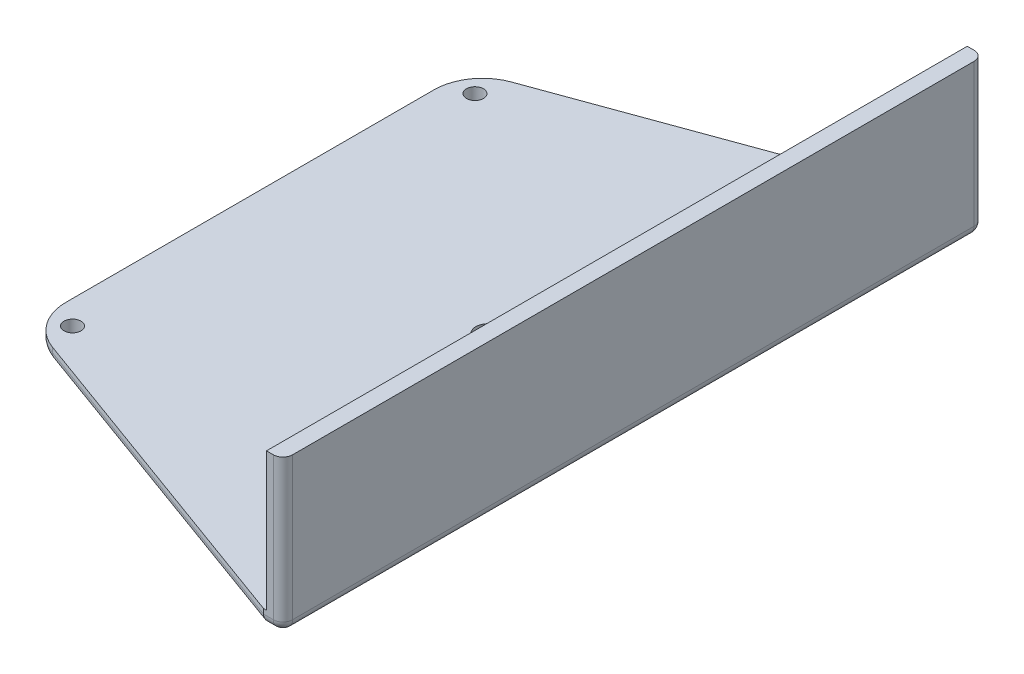
ISO-10303-21;
HEADER;
FILE_DESCRIPTION(('STEP AP214'),'2;1');
FILE_NAME('part.step','',(''),(''),'','','');
FILE_SCHEMA(('AUTOMOTIVE_DESIGN { 1 0 10303 214 1 1 1 1 }'));
ENDSEC;
DATA;
#1=APPLICATION_CONTEXT('core data for automotive mechanical design processes');
#2=APPLICATION_PROTOCOL_DEFINITION('international standard','automotive_design',2000,#1);
#3=PRODUCT_CONTEXT('',#1,'mechanical');
#4=PRODUCT('Part','Part','',(#3));
#5=PRODUCT_RELATED_PRODUCT_CATEGORY('part','',(#4));
#6=PRODUCT_DEFINITION_FORMATION('','',#4);
#7=PRODUCT_DEFINITION_CONTEXT('part definition',#1,'design');
#8=PRODUCT_DEFINITION('design','',#6,#7);
#9=PRODUCT_DEFINITION_SHAPE('','',#8);
#10=(LENGTH_UNIT() NAMED_UNIT(*) SI_UNIT(.MILLI.,.METRE.));
#11=(NAMED_UNIT(*) PLANE_ANGLE_UNIT() SI_UNIT($,.RADIAN.));
#12=(NAMED_UNIT(*) SI_UNIT($,.STERADIAN.) SOLID_ANGLE_UNIT());
#13=UNCERTAINTY_MEASURE_WITH_UNIT(LENGTH_MEASURE(1.E-05),#10,'distance_accuracy_value','');
#14=(GEOMETRIC_REPRESENTATION_CONTEXT(3) GLOBAL_UNCERTAINTY_ASSIGNED_CONTEXT((#13)) GLOBAL_UNIT_ASSIGNED_CONTEXT((#10,
#11,#12)) REPRESENTATION_CONTEXT('',''));
#15=CARTESIAN_POINT('',(0.,0.,0.));
#16=DIRECTION('',(0.,0.,1.));
#17=DIRECTION('',(1.,0.,0.));
#18=AXIS2_PLACEMENT_3D('',#15,#16,#17);
#19=CARTESIAN_POINT('',(0.,0.,0.));
#20=DIRECTION('',(0.,1.,0.));
#21=DIRECTION('',(0.,0.,1.));
#22=AXIS2_PLACEMENT_3D('',#19,#20,#21);
#23=PLANE('',#22);
#24=CARTESIAN_POINT('',(-30.,0.,0.));
#25=DIRECTION('',(0.,-1.,0.));
#26=DIRECTION('',(0.,0.,-1.));
#27=AXIS2_PLACEMENT_3D('',#24,#25,#26);
#28=CIRCLE('',#27,2.5);
#29=CARTESIAN_POINT('',(-30.,0.,-2.50000000000001));
#30=VERTEX_POINT('',#29);
#31=EDGE_CURVE('E360',#30,#30,#28,.T.);
#32=ORIENTED_EDGE('',*,*,#31,.F.);
#33=EDGE_LOOP('',(#32));
#34=FACE_BOUND('',#33,.T.);
#35=DIRECTION('',(1.,0.,0.));
#36=VECTOR('',#35,1.);
#37=CARTESIAN_POINT('',(-10.25,0.,-7.5));
#38=LINE('',#37,#36);
#39=CARTESIAN_POINT('',(-19.75,0.,-7.5));
#40=VERTEX_POINT('',#39);
#41=CARTESIAN_POINT('',(-10.25,0.,-7.5));
#42=VERTEX_POINT('',#41);
#43=EDGE_CURVE('E185',#40,#42,#38,.T.);
#44=ORIENTED_EDGE('',*,*,#43,.F.);
#45=DIRECTION('',(0.,0.,-1.));
#46=VECTOR('',#45,1.);
#47=CARTESIAN_POINT('',(-19.75,0.,7.5));
#48=LINE('',#47,#46);
#49=CARTESIAN_POINT('',(-19.75,0.,7.5));
#50=VERTEX_POINT('',#49);
#51=EDGE_CURVE('E52',#50,#40,#48,.T.);
#52=ORIENTED_EDGE('',*,*,#51,.F.);
#53=DIRECTION('',(-1.,0.,0.));
#54=VECTOR('',#53,1.);
#55=CARTESIAN_POINT('',(-10.25,0.,7.5));
#56=LINE('',#55,#54);
#57=CARTESIAN_POINT('',(-10.25,0.,7.5));
#58=VERTEX_POINT('',#57);
#59=EDGE_CURVE('E191',#58,#50,#56,.T.);
#60=ORIENTED_EDGE('',*,*,#59,.F.);
#61=DIRECTION('',(0.,0.,1.));
#62=VECTOR('',#61,1.);
#63=CARTESIAN_POINT('',(-10.25,0.,7.5));
#64=LINE('',#63,#62);
#65=EDGE_CURVE('E176',#42,#58,#64,.T.);
#66=ORIENTED_EDGE('',*,*,#65,.F.);
#67=EDGE_LOOP('',(#44,#52,#60,#66));
#68=FACE_BOUND('',#67,.T.);
#69=CARTESIAN_POINT('',(-74.2610839032561,0.,-41.5585413818937));
#70=DIRECTION('',(0.,1.,0.));
#71=DIRECTION('',(0.,0.,1.));
#72=AXIS2_PLACEMENT_3D('',#69,#70,#71);
#73=CIRCLE('',#72,1.75);
#74=CARTESIAN_POINT('',(-74.2610839032561,0.,-39.8085413818937));
#75=VERTEX_POINT('',#74);
#76=EDGE_CURVE('E204',#75,#75,#73,.T.);
#77=ORIENTED_EDGE('',*,*,#76,.T.);
#78=EDGE_LOOP('',(#77));
#79=FACE_BOUND('',#78,.T.);
#80=CARTESIAN_POINT('',(-74.2610839032561,0.,41.5585413818937));
#81=DIRECTION('',(0.,1.,0.));
#82=DIRECTION('',(0.,0.,1.));
#83=AXIS2_PLACEMENT_3D('',#80,#81,#82);
#84=CIRCLE('',#83,1.75);
#85=CARTESIAN_POINT('',(-74.2610839032561,0.,43.3085413818937));
#86=VERTEX_POINT('',#85);
#87=EDGE_CURVE('E209',#86,#86,#84,.T.);
#88=ORIENTED_EDGE('',*,*,#87,.T.);
#89=EDGE_LOOP('',(#88));
#90=FACE_BOUND('',#89,.T.);
#91=CARTESIAN_POINT('',(-69.17599616899,0.,-37.9977648873892));
#92=DIRECTION('',(0.,1.,0.));
#93=DIRECTION('',(0.,0.,1.));
#94=AXIS2_PLACEMENT_3D('',#91,#92,#93);
#95=CIRCLE('',#94,8.);
#96=CARTESIAN_POINT('',(-71.91199616899,0.,-45.5153645042882));
#97=VERTEX_POINT('',#96);
#98=CARTESIAN_POINT('',(-77.17599616899,0.,-37.9977648873892));
#99=VERTEX_POINT('',#98);
#100=EDGE_CURVE('E319',#97,#99,#95,.T.);
#101=ORIENTED_EDGE('',*,*,#100,.F.);
#102=DIRECTION('',(-0.939699952112375,0.,0.342));
#103=VECTOR('',#102,1.);
#104=CARTESIAN_POINT('',(-23.0387234789192,0.,-63.302594590265));
#105=LINE('',#104,#103);
#106=CARTESIAN_POINT('',(-3.64736814100806,0.,-70.36));
#107=VERTEX_POINT('',#106);
#108=EDGE_CURVE('E255',#97,#107,#105,.F.);
#109=ORIENTED_EDGE('',*,*,#108,.T.);
#110=DIRECTION('',(-1.,0.,0.));
#111=VECTOR('',#110,1.);
#112=CARTESIAN_POINT('',(0.,0.,-70.36));
#113=LINE('',#112,#111);
#114=CARTESIAN_POINT('',(-2.,0.,-70.36));
#115=VERTEX_POINT('',#114);
#116=EDGE_CURVE('E257',#107,#115,#113,.F.);
#117=ORIENTED_EDGE('',*,*,#116,.T.);
#118=DIRECTION('',(0.,0.,-1.));
#119=VECTOR('',#118,1.);
#120=CARTESIAN_POINT('',(-2.,0.,0.));
#121=LINE('',#120,#119);
#122=CARTESIAN_POINT('',(-2.,0.,70.36));
#123=VERTEX_POINT('',#122);
#124=EDGE_CURVE('E260',#115,#123,#121,.F.);
#125=ORIENTED_EDGE('',*,*,#124,.T.);
#126=DIRECTION('',(1.,0.,0.));
#127=VECTOR('',#126,1.);
#128=CARTESIAN_POINT('',(0.,0.,70.36));
#129=LINE('',#128,#127);
#130=CARTESIAN_POINT('',(-3.64736814100806,0.,70.36));
#131=VERTEX_POINT('',#130);
#132=EDGE_CURVE('E263',#123,#131,#129,.F.);
#133=ORIENTED_EDGE('',*,*,#132,.T.);
#134=DIRECTION('',(0.939699952112375,0.,0.342));
#135=VECTOR('',#134,1.);
#136=CARTESIAN_POINT('',(-23.0387234789192,0.,63.302594590265));
#137=LINE('',#136,#135);
#138=CARTESIAN_POINT('',(-71.91199616899,0.,45.5153645042882));
#139=VERTEX_POINT('',#138);
#140=EDGE_CURVE('E265',#131,#139,#137,.F.);
#141=ORIENTED_EDGE('',*,*,#140,.T.);
#142=CARTESIAN_POINT('',(-69.17599616899,0.,37.9977648873892));
#143=DIRECTION('',(0.,1.,0.));
#144=DIRECTION('',(0.,0.,1.));
#145=AXIS2_PLACEMENT_3D('',#142,#143,#144);
#146=CIRCLE('',#145,8.);
#147=CARTESIAN_POINT('',(-77.17599616899,0.,37.9977648873892));
#148=VERTEX_POINT('',#147);
#149=EDGE_CURVE('E312',#148,#139,#146,.T.);
#150=ORIENTED_EDGE('',*,*,#149,.F.);
#151=DIRECTION('',(0.,0.,1.));
#152=VECTOR('',#151,1.);
#153=CARTESIAN_POINT('',(-77.17599616899,0.,0.));
#154=LINE('',#153,#152);
#155=EDGE_CURVE('E268',#148,#99,#154,.F.);
#156=ORIENTED_EDGE('',*,*,#155,.T.);
#157=EDGE_LOOP('',(#101,#109,#117,#125,#133,#141,#150,#156));
#158=FACE_BOUND('',#157,.T.);
#159=ADVANCED_FACE('F36',(#34,#68,#79,#90,#158),#23,.F.);
#160=CARTESIAN_POINT('',(-79.17599616899,3.,-45.));
#161=DIRECTION('',(0.342,0.,0.939699952112375));
#162=DIRECTION('',(0.939699952112375,0.,-0.342));
#163=AXIS2_PLACEMENT_3D('',#160,#161,#162);
#164=PLANE('',#163);
#165=DIRECTION('',(-0.939699952112375,0.,0.342));
#166=VECTOR('',#165,1.);
#167=CARTESIAN_POINT('',(-79.17599616899,2.,-45.));
#168=LINE('',#167,#166);
#169=CARTESIAN_POINT('',(-4.,2.,-72.36));
#170=VERTEX_POINT('',#169);
#171=CARTESIAN_POINT('',(-72.59599616899,2.,-47.3947644085129));
#172=VERTEX_POINT('',#171);
#173=EDGE_CURVE('E281',#170,#172,#168,.T.);
#174=ORIENTED_EDGE('',*,*,#173,.T.);
#175=DIRECTION('',(0.,-1.,0.));
#176=VECTOR('',#175,1.);
#177=CARTESIAN_POINT('',(-72.59599616899,3.,-47.3947644085129));
#178=LINE('',#177,#176);
#179=CARTESIAN_POINT('',(-72.59599616899,3.,-47.3947644085129));
#180=VERTEX_POINT('',#179);
#181=EDGE_CURVE('E341',#172,#180,#178,.F.);
#182=ORIENTED_EDGE('',*,*,#181,.T.);
#183=DIRECTION('',(-0.939699952112375,0.,0.342));
#184=VECTOR('',#183,1.);
#185=CARTESIAN_POINT('',(-79.17599616899,3.,-45.));
#186=LINE('',#185,#184);
#187=CARTESIAN_POINT('',(-4.,3.,-72.36));
#188=VERTEX_POINT('',#187);
#189=EDGE_CURVE('E230',#188,#180,#186,.T.);
#190=ORIENTED_EDGE('',*,*,#189,.F.);
#191=DIRECTION('',(0.,-1.,0.));
#192=VECTOR('',#191,1.);
#193=CARTESIAN_POINT('',(-4.,3.,-72.36));
#194=LINE('',#193,#192);
#195=EDGE_CURVE('E242',#188,#170,#194,.T.);
#196=ORIENTED_EDGE('',*,*,#195,.T.);
#197=EDGE_LOOP('',(#174,#182,#190,#196));
#198=FACE_BOUND('',#197,.T.);
#199=ADVANCED_FACE('F368',(#198),#164,.F.);
#200=CARTESIAN_POINT('',(-79.17599616899,3.,-45.));
#201=DIRECTION('',(1.,0.,0.));
#202=DIRECTION('',(0.,0.,-1.));
#203=AXIS2_PLACEMENT_3D('',#200,#201,#202);
#204=PLANE('',#203);
#205=DIRECTION('',(0.,0.,1.));
#206=VECTOR('',#205,1.);
#207=CARTESIAN_POINT('',(-79.17599616899,2.,-45.));
#208=LINE('',#207,#206);
#209=CARTESIAN_POINT('',(-79.17599616899,2.,-37.9977648873892));
#210=VERTEX_POINT('',#209);
#211=CARTESIAN_POINT('',(-79.17599616899,2.,37.9977648873892));
#212=VERTEX_POINT('',#211);
#213=EDGE_CURVE('E248',#210,#212,#208,.T.);
#214=ORIENTED_EDGE('',*,*,#213,.T.);
#215=DIRECTION('',(0.,-1.,0.));
#216=VECTOR('',#215,1.);
#217=CARTESIAN_POINT('',(-79.17599616899,3.,37.9977648873892));
#218=LINE('',#217,#216);
#219=CARTESIAN_POINT('',(-79.17599616899,3.,37.9977648873891));
#220=VERTEX_POINT('',#219);
#221=EDGE_CURVE('E335',#212,#220,#218,.F.);
#222=ORIENTED_EDGE('',*,*,#221,.T.);
#223=DIRECTION('',(0.,0.,1.));
#224=VECTOR('',#223,1.);
#225=CARTESIAN_POINT('',(-79.17599616899,3.,-45.));
#226=LINE('',#225,#224);
#227=CARTESIAN_POINT('',(-79.17599616899,3.,-37.9977648873892));
#228=VERTEX_POINT('',#227);
#229=EDGE_CURVE('E233',#228,#220,#226,.T.);
#230=ORIENTED_EDGE('',*,*,#229,.F.);
#231=DIRECTION('',(0.,-1.,0.));
#232=VECTOR('',#231,1.);
#233=CARTESIAN_POINT('',(-79.17599616899,3.,-37.9977648873892));
#234=LINE('',#233,#232);
#235=EDGE_CURVE('E333',#228,#210,#234,.T.);
#236=ORIENTED_EDGE('',*,*,#235,.T.);
#237=EDGE_LOOP('',(#214,#222,#230,#236));
#238=FACE_BOUND('',#237,.T.);
#239=ADVANCED_FACE('F375',(#238),#204,.F.);
#240=CARTESIAN_POINT('',(-79.17599616899,3.,45.));
#241=DIRECTION('',(0.342,0.,-0.939699952112375));
#242=DIRECTION('',(-0.939699952112375,0.,-0.342));
#243=AXIS2_PLACEMENT_3D('',#240,#241,#242);
#244=PLANE('',#243);
#245=DIRECTION('',(0.939699952112375,0.,0.342));
#246=VECTOR('',#245,1.);
#247=CARTESIAN_POINT('',(-79.17599616899,3.,45.));
#248=LINE('',#247,#246);
#249=CARTESIAN_POINT('',(-72.59599616899,3.,47.3947644085129));
#250=VERTEX_POINT('',#249);
#251=CARTESIAN_POINT('',(-4.,3.,72.36));
#252=VERTEX_POINT('',#251);
#253=EDGE_CURVE('E236',#250,#252,#248,.T.);
#254=ORIENTED_EDGE('',*,*,#253,.F.);
#255=DIRECTION('',(0.,-1.,0.));
#256=VECTOR('',#255,1.);
#257=CARTESIAN_POINT('',(-72.59599616899,3.,47.3947644085129));
#258=LINE('',#257,#256);
#259=CARTESIAN_POINT('',(-72.59599616899,2.,47.3947644085129));
#260=VERTEX_POINT('',#259);
#261=EDGE_CURVE('E331',#250,#260,#258,.T.);
#262=ORIENTED_EDGE('',*,*,#261,.T.);
#263=DIRECTION('',(0.939699952112375,0.,0.342));
#264=VECTOR('',#263,1.);
#265=CARTESIAN_POINT('',(-79.17599616899,2.,45.));
#266=LINE('',#265,#264);
#267=CARTESIAN_POINT('',(-4.,2.,72.36));
#268=VERTEX_POINT('',#267);
#269=EDGE_CURVE('E271',#260,#268,#266,.T.);
#270=ORIENTED_EDGE('',*,*,#269,.T.);
#271=DIRECTION('',(0.,-1.,0.));
#272=VECTOR('',#271,1.);
#273=CARTESIAN_POINT('',(-4.,3.,72.36));
#274=LINE('',#273,#272);
#275=EDGE_CURVE('E245',#252,#268,#274,.T.);
#276=ORIENTED_EDGE('',*,*,#275,.F.);
#277=EDGE_LOOP('',(#254,#262,#270,#276));
#278=FACE_BOUND('',#277,.T.);
#279=ADVANCED_FACE('F392',(#278),#244,.F.);
#280=CARTESIAN_POINT('',(-4.,3.,72.36));
#281=DIRECTION('',(0.,0.,-1.));
#282=DIRECTION('',(-1.,0.,0.));
#283=AXIS2_PLACEMENT_3D('',#280,#281,#282);
#284=PLANE('',#283);
#285=DIRECTION('',(1.,0.,0.));
#286=VECTOR('',#285,1.);
#287=CARTESIAN_POINT('',(-4.,2.,72.36));
#288=LINE('',#287,#286);
#289=CARTESIAN_POINT('',(-2.,2.,72.36));
#290=VERTEX_POINT('',#289);
#291=EDGE_CURVE('E273',#268,#290,#288,.T.);
#292=ORIENTED_EDGE('',*,*,#291,.T.);
#293=DIRECTION('',(0.,-1.,0.));
#294=VECTOR('',#293,1.);
#295=CARTESIAN_POINT('',(-2.,3.,72.36));
#296=LINE('',#295,#294);
#297=CARTESIAN_POINT('',(-2.,31.5,72.36));
#298=VERTEX_POINT('',#297);
#299=EDGE_CURVE('E304',#290,#298,#296,.F.);
#300=ORIENTED_EDGE('',*,*,#299,.T.);
#301=DIRECTION('',(-1.,0.,0.));
#302=VECTOR('',#301,1.);
#303=CARTESIAN_POINT('',(0.,31.5,72.36));
#304=LINE('',#303,#302);
#305=CARTESIAN_POINT('',(-3.4,31.5,72.36));
#306=VERTEX_POINT('',#305);
#307=EDGE_CURVE('E216',#298,#306,#304,.T.);
#308=ORIENTED_EDGE('',*,*,#307,.T.);
#309=DIRECTION('',(0.,-1.,0.));
#310=VECTOR('',#309,1.);
#311=CARTESIAN_POINT('',(-3.4,31.5,72.36));
#312=LINE('',#311,#310);
#313=CARTESIAN_POINT('',(-3.4,3.,72.36));
#314=VERTEX_POINT('',#313);
#315=EDGE_CURVE('E221',#306,#314,#312,.T.);
#316=ORIENTED_EDGE('',*,*,#315,.T.);
#317=DIRECTION('',(1.,0.,0.));
#318=VECTOR('',#317,1.);
#319=CARTESIAN_POINT('',(-4.,3.,72.36));
#320=LINE('',#319,#318);
#321=EDGE_CURVE('E238',#252,#314,#320,.T.);
#322=ORIENTED_EDGE('',*,*,#321,.F.);
#323=ORIENTED_EDGE('',*,*,#275,.T.);
#324=EDGE_LOOP('',(#292,#300,#308,#316,#322,#323));
#325=FACE_BOUND('',#324,.T.);
#326=ADVANCED_FACE('F388',(#325),#284,.F.);
#327=CARTESIAN_POINT('',(0.,3.,72.36));
#328=DIRECTION('',(-1.,0.,0.));
#329=DIRECTION('',(0.,0.,1.));
#330=AXIS2_PLACEMENT_3D('',#327,#328,#329);
#331=PLANE('',#330);
#332=DIRECTION('',(0.,0.,1.));
#333=VECTOR('',#332,1.);
#334=CARTESIAN_POINT('',(0.,31.5,-72.36));
#335=LINE('',#334,#333);
#336=CARTESIAN_POINT('',(0.,31.5,-70.36));
#337=VERTEX_POINT('',#336);
#338=CARTESIAN_POINT('',(0.,31.5,70.36));
#339=VERTEX_POINT('',#338);
#340=EDGE_CURVE('E213',#337,#339,#335,.T.);
#341=ORIENTED_EDGE('',*,*,#340,.T.);
#342=DIRECTION('',(0.,-1.,0.));
#343=VECTOR('',#342,1.);
#344=CARTESIAN_POINT('',(0.,3.,70.36));
#345=LINE('',#344,#343);
#346=CARTESIAN_POINT('',(0.,2.,70.36));
#347=VERTEX_POINT('',#346);
#348=EDGE_CURVE('E302',#339,#347,#345,.T.);
#349=ORIENTED_EDGE('',*,*,#348,.T.);
#350=DIRECTION('',(0.,0.,-1.));
#351=VECTOR('',#350,1.);
#352=CARTESIAN_POINT('',(0.,2.,72.36));
#353=LINE('',#352,#351);
#354=CARTESIAN_POINT('',(0.,2.,-70.36));
#355=VERTEX_POINT('',#354);
#356=EDGE_CURVE('E276',#347,#355,#353,.T.);
#357=ORIENTED_EDGE('',*,*,#356,.T.);
#358=DIRECTION('',(0.,-1.,0.));
#359=VECTOR('',#358,1.);
#360=CARTESIAN_POINT('',(0.,3.,-70.36));
#361=LINE('',#360,#359);
#362=EDGE_CURVE('E300',#355,#337,#361,.F.);
#363=ORIENTED_EDGE('',*,*,#362,.T.);
#364=EDGE_LOOP('',(#341,#349,#357,#363));
#365=FACE_BOUND('',#364,.T.);
#366=ADVANCED_FACE('F384',(#365),#331,.F.);
#367=CARTESIAN_POINT('',(-4.,3.,-72.36));
#368=DIRECTION('',(0.,0.,1.));
#369=DIRECTION('',(1.,0.,0.));
#370=AXIS2_PLACEMENT_3D('',#367,#368,#369);
#371=PLANE('',#370);
#372=DIRECTION('',(1.,0.,0.));
#373=VECTOR('',#372,1.);
#374=CARTESIAN_POINT('',(-3.4,31.5,-72.36));
#375=LINE('',#374,#373);
#376=CARTESIAN_POINT('',(-3.4,31.5,-72.36));
#377=VERTEX_POINT('',#376);
#378=CARTESIAN_POINT('',(-2.,31.5,-72.36));
#379=VERTEX_POINT('',#378);
#380=EDGE_CURVE('E210',#377,#379,#375,.T.);
#381=ORIENTED_EDGE('',*,*,#380,.T.);
#382=DIRECTION('',(0.,-1.,0.));
#383=VECTOR('',#382,1.);
#384=CARTESIAN_POINT('',(-2.,3.,-72.36));
#385=LINE('',#384,#383);
#386=CARTESIAN_POINT('',(-2.,2.,-72.36));
#387=VERTEX_POINT('',#386);
#388=EDGE_CURVE('E310',#379,#387,#385,.T.);
#389=ORIENTED_EDGE('',*,*,#388,.T.);
#390=DIRECTION('',(-1.,0.,0.));
#391=VECTOR('',#390,1.);
#392=CARTESIAN_POINT('',(-4.,2.,-72.36));
#393=LINE('',#392,#391);
#394=EDGE_CURVE('E279',#387,#170,#393,.T.);
#395=ORIENTED_EDGE('',*,*,#394,.T.);
#396=ORIENTED_EDGE('',*,*,#195,.F.);
#397=DIRECTION('',(-1.,0.,0.));
#398=VECTOR('',#397,1.);
#399=CARTESIAN_POINT('',(-4.,3.,-72.36));
#400=LINE('',#399,#398);
#401=CARTESIAN_POINT('',(-3.4,3.,-72.36));
#402=VERTEX_POINT('',#401);
#403=EDGE_CURVE('E240',#402,#188,#400,.T.);
#404=ORIENTED_EDGE('',*,*,#403,.F.);
#405=DIRECTION('',(0.,-1.,0.));
#406=VECTOR('',#405,1.);
#407=CARTESIAN_POINT('',(-3.4,31.5,-72.36));
#408=LINE('',#407,#406);
#409=EDGE_CURVE('E222',#377,#402,#408,.T.);
#410=ORIENTED_EDGE('',*,*,#409,.F.);
#411=EDGE_LOOP('',(#381,#389,#395,#396,#404,#410));
#412=FACE_BOUND('',#411,.T.);
#413=ADVANCED_FACE('F381',(#412),#371,.F.);
#414=CARTESIAN_POINT('',(0.,3.,0.));
#415=DIRECTION('',(0.,1.,0.));
#416=DIRECTION('',(0.,0.,1.));
#417=AXIS2_PLACEMENT_3D('',#414,#415,#416);
#418=PLANE('',#417);
#419=CARTESIAN_POINT('',(-30.,3.,0.));
#420=DIRECTION('',(0.,1.,0.));
#421=DIRECTION('',(0.,0.,1.));
#422=AXIS2_PLACEMENT_3D('',#419,#420,#421);
#423=CIRCLE('',#422,2.5);
#424=CARTESIAN_POINT('',(-30.,3.,2.5));
#425=VERTEX_POINT('',#424);
#426=EDGE_CURVE('E40',#425,#425,#423,.T.);
#427=ORIENTED_EDGE('',*,*,#426,.F.);
#428=EDGE_LOOP('',(#427));
#429=FACE_BOUND('',#428,.T.);
#430=DIRECTION('',(0.,0.,1.));
#431=VECTOR('',#430,1.);
#432=CARTESIAN_POINT('',(-19.75,3.,0.));
#433=LINE('',#432,#431);
#434=CARTESIAN_POINT('',(-19.75,3.,-7.5));
#435=VERTEX_POINT('',#434);
#436=CARTESIAN_POINT('',(-19.75,3.,7.5));
#437=VERTEX_POINT('',#436);
#438=EDGE_CURVE('E12',#435,#437,#433,.T.);
#439=ORIENTED_EDGE('',*,*,#438,.F.);
#440=DIRECTION('',(-1.,0.,0.));
#441=VECTOR('',#440,1.);
#442=CARTESIAN_POINT('',(0.,3.,-7.5));
#443=LINE('',#442,#441);
#444=CARTESIAN_POINT('',(-10.25,3.,-7.5));
#445=VERTEX_POINT('',#444);
#446=EDGE_CURVE('E343',#445,#435,#443,.T.);
#447=ORIENTED_EDGE('',*,*,#446,.F.);
#448=DIRECTION('',(0.,0.,-1.));
#449=VECTOR('',#448,1.);
#450=CARTESIAN_POINT('',(-10.25,3.,0.));
#451=LINE('',#450,#449);
#452=CARTESIAN_POINT('',(-10.25,3.,7.5));
#453=VERTEX_POINT('',#452);
#454=EDGE_CURVE('E179',#453,#445,#451,.T.);
#455=ORIENTED_EDGE('',*,*,#454,.F.);
#456=DIRECTION('',(1.,0.,0.));
#457=VECTOR('',#456,1.);
#458=CARTESIAN_POINT('',(0.,3.,7.5));
#459=LINE('',#458,#457);
#460=EDGE_CURVE('E45',#437,#453,#459,.T.);
#461=ORIENTED_EDGE('',*,*,#460,.F.);
#462=EDGE_LOOP('',(#439,#447,#455,#461));
#463=FACE_BOUND('',#462,.T.);
#464=CARTESIAN_POINT('',(-74.2610839032561,3.,-41.5585413818937));
#465=DIRECTION('',(0.,1.,0.));
#466=DIRECTION('',(0.,0.,-1.));
#467=AXIS2_PLACEMENT_3D('',#464,#465,#466);
#468=CIRCLE('',#467,1.75);
#469=CARTESIAN_POINT('',(-74.2610839032561,3.,-43.3085413818937));
#470=VERTEX_POINT('',#469);
#471=EDGE_CURVE('E201',#470,#470,#468,.T.);
#472=ORIENTED_EDGE('',*,*,#471,.F.);
#473=EDGE_LOOP('',(#472));
#474=FACE_BOUND('',#473,.T.);
#475=CARTESIAN_POINT('',(-74.2610839032561,3.,41.5585413818937));
#476=DIRECTION('',(0.,1.,0.));
#477=DIRECTION('',(0.,0.,1.));
#478=AXIS2_PLACEMENT_3D('',#475,#476,#477);
#479=CIRCLE('',#478,1.75);
#480=CARTESIAN_POINT('',(-74.2610839032561,3.,43.3085413818937));
#481=VERTEX_POINT('',#480);
#482=EDGE_CURVE('E206',#481,#481,#479,.T.);
#483=ORIENTED_EDGE('',*,*,#482,.F.);
#484=EDGE_LOOP('',(#483));
#485=FACE_BOUND('',#484,.T.);
#486=ORIENTED_EDGE('',*,*,#229,.T.);
#487=CARTESIAN_POINT('',(-69.17599616899,3.,37.9977648873892));
#488=DIRECTION('',(0.,1.,0.));
#489=DIRECTION('',(0.,0.,1.));
#490=AXIS2_PLACEMENT_3D('',#487,#488,#489);
#491=CIRCLE('',#490,10.);
#492=EDGE_CURVE('E339',#220,#250,#491,.T.);
#493=ORIENTED_EDGE('',*,*,#492,.T.);
#494=ORIENTED_EDGE('',*,*,#253,.T.);
#495=ORIENTED_EDGE('',*,*,#321,.T.);
#496=DIRECTION('',(0.,0.,1.));
#497=VECTOR('',#496,1.);
#498=CARTESIAN_POINT('',(-3.4,3.,0.));
#499=LINE('',#498,#497);
#500=EDGE_CURVE('E225',#402,#314,#499,.T.);
#501=ORIENTED_EDGE('',*,*,#500,.F.);
#502=ORIENTED_EDGE('',*,*,#403,.T.);
#503=ORIENTED_EDGE('',*,*,#189,.T.);
#504=CARTESIAN_POINT('',(-69.17599616899,3.,-37.9977648873892));
#505=DIRECTION('',(0.,1.,0.));
#506=DIRECTION('',(0.,0.,1.));
#507=AXIS2_PLACEMENT_3D('',#504,#505,#506);
#508=CIRCLE('',#507,10.);
#509=EDGE_CURVE('E337',#180,#228,#508,.T.);
#510=ORIENTED_EDGE('',*,*,#509,.T.);
#511=EDGE_LOOP('',(#486,#493,#494,#495,#501,#502,#503,#510));
#512=FACE_BOUND('',#511,.T.);
#513=ADVANCED_FACE('F356',(#429,#463,#474,#485,#512),#418,.T.);
#514=CARTESIAN_POINT('',(-3.4,31.5,-72.36));
#515=DIRECTION('',(-1.,0.,0.));
#516=DIRECTION('',(0.,0.,1.));
#517=AXIS2_PLACEMENT_3D('',#514,#515,#516);
#518=PLANE('',#517);
#519=ORIENTED_EDGE('',*,*,#409,.T.);
#520=ORIENTED_EDGE('',*,*,#500,.T.);
#521=ORIENTED_EDGE('',*,*,#315,.F.);
#522=DIRECTION('',(0.,0.,-1.));
#523=VECTOR('',#522,1.);
#524=CARTESIAN_POINT('',(-3.4,31.5,-72.36));
#525=LINE('',#524,#523);
#526=EDGE_CURVE('E218',#306,#377,#525,.T.);
#527=ORIENTED_EDGE('',*,*,#526,.T.);
#528=EDGE_LOOP('',(#519,#520,#521,#527));
#529=FACE_BOUND('',#528,.T.);
#530=ADVANCED_FACE('F509',(#529),#518,.T.);
#531=CARTESIAN_POINT('',(0.,31.5,0.));
#532=DIRECTION('',(0.,-1.,0.));
#533=DIRECTION('',(0.,0.,-1.));
#534=AXIS2_PLACEMENT_3D('',#531,#532,#533);
#535=PLANE('',#534);
#536=ORIENTED_EDGE('',*,*,#307,.F.);
#537=CARTESIAN_POINT('',(-2.,31.5,70.36));
#538=DIRECTION('',(0.,-1.,0.));
#539=DIRECTION('',(0.,0.,-1.));
#540=AXIS2_PLACEMENT_3D('',#537,#538,#539);
#541=CIRCLE('',#540,2.);
#542=EDGE_CURVE('E308',#298,#339,#541,.F.);
#543=ORIENTED_EDGE('',*,*,#542,.T.);
#544=ORIENTED_EDGE('',*,*,#340,.F.);
#545=CARTESIAN_POINT('',(-2.,31.5,-70.36));
#546=DIRECTION('',(0.,-1.,0.));
#547=DIRECTION('',(0.,0.,-1.));
#548=AXIS2_PLACEMENT_3D('',#545,#546,#547);
#549=CIRCLE('',#548,2.);
#550=EDGE_CURVE('E306',#337,#379,#549,.F.);
#551=ORIENTED_EDGE('',*,*,#550,.T.);
#552=ORIENTED_EDGE('',*,*,#380,.F.);
#553=ORIENTED_EDGE('',*,*,#526,.F.);
#554=EDGE_LOOP('',(#536,#543,#544,#551,#552,#553));
#555=FACE_BOUND('',#554,.T.);
#556=ADVANCED_FACE('F502',(#555),#535,.F.);
#557=CARTESIAN_POINT('',(-74.2610839032561,-37.,41.5585413818937));
#558=DIRECTION('',(0.,1.,0.));
#559=DIRECTION('',(0.,0.,1.));
#560=AXIS2_PLACEMENT_3D('',#557,#558,#559);
#561=CYLINDRICAL_SURFACE('',#560,1.75);
#562=ORIENTED_EDGE('',*,*,#482,.T.);
#563=EDGE_LOOP('',(#562));
#564=FACE_BOUND('',#563,.T.);
#565=ORIENTED_EDGE('',*,*,#87,.F.);
#566=EDGE_LOOP('',(#565));
#567=FACE_BOUND('',#566,.T.);
#568=ADVANCED_FACE('F515',(#564,#567),#561,.F.);
#569=CARTESIAN_POINT('',(-74.2610839032561,-37.,-41.5585413818937));
#570=DIRECTION('',(0.,1.,0.));
#571=DIRECTION('',(0.,0.,1.));
#572=AXIS2_PLACEMENT_3D('',#569,#570,#571);
#573=CYLINDRICAL_SURFACE('',#572,1.75);
#574=ORIENTED_EDGE('',*,*,#471,.T.);
#575=EDGE_LOOP('',(#574));
#576=FACE_BOUND('',#575,.T.);
#577=ORIENTED_EDGE('',*,*,#76,.F.);
#578=EDGE_LOOP('',(#577));
#579=FACE_BOUND('',#578,.T.);
#580=ADVANCED_FACE('F424',(#576,#579),#573,.F.);
#581=CARTESIAN_POINT('',(-2.,2.,72.36));
#582=DIRECTION('',(0.,0.,-1.));
#583=DIRECTION('',(-1.,0.,0.));
#584=AXIS2_PLACEMENT_3D('',#581,#582,#583);
#585=CYLINDRICAL_SURFACE('',#584,2.);
#586=ORIENTED_EDGE('',*,*,#356,.F.);
#587=CARTESIAN_POINT('',(-2.,2.,70.36));
#588=DIRECTION('',(0.,0.,-1.));
#589=DIRECTION('',(-1.,0.,0.));
#590=AXIS2_PLACEMENT_3D('',#587,#588,#589);
#591=CIRCLE('',#590,2.);
#592=EDGE_CURVE('E295',#347,#123,#591,.T.);
#593=ORIENTED_EDGE('',*,*,#592,.T.);
#594=ORIENTED_EDGE('',*,*,#124,.F.);
#595=CARTESIAN_POINT('',(-2.,2.,-70.36));
#596=DIRECTION('',(0.,0.,-1.));
#597=DIRECTION('',(-1.,0.,0.));
#598=AXIS2_PLACEMENT_3D('',#595,#596,#597);
#599=CIRCLE('',#598,2.);
#600=EDGE_CURVE('E293',#115,#355,#599,.F.);
#601=ORIENTED_EDGE('',*,*,#600,.T.);
#602=EDGE_LOOP('',(#586,#593,#594,#601));
#603=FACE_BOUND('',#602,.T.);
#604=ADVANCED_FACE('F420',(#603),#585,.T.);
#605=CARTESIAN_POINT('',(-4.,2.,-70.36));
#606=DIRECTION('',(-1.,0.,0.));
#607=DIRECTION('',(0.,0.,1.));
#608=AXIS2_PLACEMENT_3D('',#605,#606,#607);
#609=CYLINDRICAL_SURFACE('',#608,2.);
#610=ORIENTED_EDGE('',*,*,#394,.F.);
#611=CARTESIAN_POINT('',(-2.,2.,-70.36));
#612=DIRECTION('',(-1.,0.,0.));
#613=DIRECTION('',(0.,0.,1.));
#614=AXIS2_PLACEMENT_3D('',#611,#612,#613);
#615=CIRCLE('',#614,2.);
#616=EDGE_CURVE('E297',#387,#115,#615,.T.);
#617=ORIENTED_EDGE('',*,*,#616,.T.);
#618=ORIENTED_EDGE('',*,*,#116,.F.);
#619=CARTESIAN_POINT('',(-3.64736814100799,2.,-70.36));
#620=DIRECTION('',(-0.984809614116448,0.,0.173637622489518));
#621=DIRECTION('',(0.173637622489518,0.,0.984809614116448));
#622=AXIS2_PLACEMENT_3D('',#619,#620,#621);
#623=ELLIPSE('',#622,2.03084938584232,2.);
#624=EDGE_CURVE('E205',#170,#107,#623,.T.);
#625=ORIENTED_EDGE('',*,*,#624,.F.);
#626=EDGE_LOOP('',(#610,#617,#618,#625));
#627=FACE_BOUND('',#626,.T.);
#628=ADVANCED_FACE('F416',(#627),#609,.T.);
#629=CARTESIAN_POINT('',(-4.,2.,70.36));
#630=DIRECTION('',(1.,0.,0.));
#631=DIRECTION('',(0.,0.,-1.));
#632=AXIS2_PLACEMENT_3D('',#629,#630,#631);
#633=CYLINDRICAL_SURFACE('',#632,2.);
#634=ORIENTED_EDGE('',*,*,#132,.F.);
#635=CARTESIAN_POINT('',(-2.,2.,70.36));
#636=DIRECTION('',(1.,0.,0.));
#637=DIRECTION('',(0.,0.,-1.));
#638=AXIS2_PLACEMENT_3D('',#635,#636,#637);
#639=CIRCLE('',#638,2.);
#640=EDGE_CURVE('E284',#123,#290,#639,.F.);
#641=ORIENTED_EDGE('',*,*,#640,.T.);
#642=ORIENTED_EDGE('',*,*,#291,.F.);
#643=CARTESIAN_POINT('',(-3.64736814100785,2.,70.36));
#644=DIRECTION('',(0.984809614116448,0.,0.173637622489518));
#645=DIRECTION('',(0.173637622489518,0.,-0.984809614116448));
#646=AXIS2_PLACEMENT_3D('',#643,#644,#645);
#647=ELLIPSE('',#646,2.03084938584232,2.);
#648=EDGE_CURVE('E285',#131,#268,#647,.F.);
#649=ORIENTED_EDGE('',*,*,#648,.F.);
#650=EDGE_LOOP('',(#634,#641,#642,#649));
#651=FACE_BOUND('',#650,.T.);
#652=ADVANCED_FACE('F412',(#651),#633,.T.);
#653=CARTESIAN_POINT('',(-78.49199616899,2.,-43.1206000957753));
#654=DIRECTION('',(-0.939699952112375,0.,0.342));
#655=DIRECTION('',(0.342,0.,0.939699952112375));
#656=AXIS2_PLACEMENT_3D('',#653,#654,#655);
#657=CYLINDRICAL_SURFACE('',#656,2.);
#658=ORIENTED_EDGE('',*,*,#108,.F.);
#659=CARTESIAN_POINT('',(-71.91199616899,2.,-45.5153645042882));
#660=DIRECTION('',(0.939699952112374,0.,-0.342000000000002));
#661=DIRECTION('',(-0.342000000000002,0.,-0.939699952112374));
#662=AXIS2_PLACEMENT_3D('',#659,#660,#661);
#663=CIRCLE('',#662,2.);
#664=EDGE_CURVE('E329',#97,#172,#663,.T.);
#665=ORIENTED_EDGE('',*,*,#664,.T.);
#666=ORIENTED_EDGE('',*,*,#173,.F.);
#667=ORIENTED_EDGE('',*,*,#624,.T.);
#668=EDGE_LOOP('',(#658,#665,#666,#667));
#669=FACE_BOUND('',#668,.T.);
#670=ADVANCED_FACE('F408',(#669),#657,.T.);
#671=CARTESIAN_POINT('',(-78.49199616899,2.,43.1206000957753));
#672=DIRECTION('',(0.939699952112375,0.,0.342));
#673=DIRECTION('',(0.342,0.,-0.939699952112375));
#674=AXIS2_PLACEMENT_3D('',#671,#672,#673);
#675=CYLINDRICAL_SURFACE('',#674,2.);
#676=ORIENTED_EDGE('',*,*,#269,.F.);
#677=CARTESIAN_POINT('',(-71.91199616899,2.,45.5153645042882));
#678=DIRECTION('',(0.939699952112374,0.,0.342000000000002));
#679=DIRECTION('',(0.342000000000002,0.,-0.939699952112374));
#680=AXIS2_PLACEMENT_3D('',#677,#678,#679);
#681=CIRCLE('',#680,2.);
#682=EDGE_CURVE('E326',#260,#139,#681,.T.);
#683=ORIENTED_EDGE('',*,*,#682,.T.);
#684=ORIENTED_EDGE('',*,*,#140,.F.);
#685=ORIENTED_EDGE('',*,*,#648,.T.);
#686=EDGE_LOOP('',(#676,#683,#684,#685));
#687=FACE_BOUND('',#686,.T.);
#688=ADVANCED_FACE('F404',(#687),#675,.T.);
#689=CARTESIAN_POINT('',(-77.17599616899,2.,-45.));
#690=DIRECTION('',(0.,0.,1.));
#691=DIRECTION('',(1.,0.,0.));
#692=AXIS2_PLACEMENT_3D('',#689,#690,#691);
#693=CYLINDRICAL_SURFACE('',#692,2.);
#694=ORIENTED_EDGE('',*,*,#213,.F.);
#695=CARTESIAN_POINT('',(-77.17599616899,2.,-37.9977648873892));
#696=DIRECTION('',(0.,0.,1.));
#697=DIRECTION('',(1.,0.,0.));
#698=AXIS2_PLACEMENT_3D('',#695,#696,#697);
#699=CIRCLE('',#698,2.);
#700=EDGE_CURVE('E324',#210,#99,#699,.T.);
#701=ORIENTED_EDGE('',*,*,#700,.T.);
#702=ORIENTED_EDGE('',*,*,#155,.F.);
#703=CARTESIAN_POINT('',(-77.17599616899,2.,37.9977648873892));
#704=DIRECTION('',(0.,0.,-1.));
#705=DIRECTION('',(-1.,0.,0.));
#706=AXIS2_PLACEMENT_3D('',#703,#704,#705);
#707=CIRCLE('',#706,2.);
#708=EDGE_CURVE('E322',#148,#212,#707,.T.);
#709=ORIENTED_EDGE('',*,*,#708,.T.);
#710=EDGE_LOOP('',(#694,#701,#702,#709));
#711=FACE_BOUND('',#710,.T.);
#712=ADVANCED_FACE('F400',(#711),#693,.T.);
#713=CARTESIAN_POINT('',(-2.,3.,70.36));
#714=DIRECTION('',(0.,-1.,0.));
#715=DIRECTION('',(0.,0.,-1.));
#716=AXIS2_PLACEMENT_3D('',#713,#714,#715);
#717=CYLINDRICAL_SURFACE('',#716,2.);
#718=ORIENTED_EDGE('',*,*,#542,.F.);
#719=ORIENTED_EDGE('',*,*,#299,.F.);
#720=CARTESIAN_POINT('',(-2.,2.,70.36));
#721=DIRECTION('',(0.,-1.,0.));
#722=DIRECTION('',(0.,0.,-1.));
#723=AXIS2_PLACEMENT_3D('',#720,#721,#722);
#724=CIRCLE('',#723,2.);
#725=EDGE_CURVE('E288',#347,#290,#724,.T.);
#726=ORIENTED_EDGE('',*,*,#725,.F.);
#727=ORIENTED_EDGE('',*,*,#348,.F.);
#728=EDGE_LOOP('',(#718,#719,#726,#727));
#729=FACE_BOUND('',#728,.T.);
#730=ADVANCED_FACE('F403',(#729),#717,.T.);
#731=CARTESIAN_POINT('',(-2.,2.,70.36));
#732=DIRECTION('',(0.,0.,1.));
#733=DIRECTION('',(1.,0.,0.));
#734=AXIS2_PLACEMENT_3D('',#731,#732,#733);
#735=SPHERICAL_SURFACE('',#734,2.);
#736=ORIENTED_EDGE('',*,*,#640,.F.);
#737=ORIENTED_EDGE('',*,*,#592,.F.);
#738=ORIENTED_EDGE('',*,*,#725,.T.);
#739=EDGE_LOOP('',(#736,#737,#738));
#740=FACE_BOUND('',#739,.T.);
#741=ADVANCED_FACE('F426',(#740),#735,.T.);
#742=CARTESIAN_POINT('',(-2.,3.,-70.36));
#743=DIRECTION('',(0.,-1.,0.));
#744=DIRECTION('',(0.,0.,-1.));
#745=AXIS2_PLACEMENT_3D('',#742,#743,#744);
#746=CYLINDRICAL_SURFACE('',#745,2.);
#747=ORIENTED_EDGE('',*,*,#550,.F.);
#748=ORIENTED_EDGE('',*,*,#362,.F.);
#749=CARTESIAN_POINT('',(-2.,2.,-70.36));
#750=DIRECTION('',(0.,-1.,0.));
#751=DIRECTION('',(0.,0.,-1.));
#752=AXIS2_PLACEMENT_3D('',#749,#750,#751);
#753=CIRCLE('',#752,2.);
#754=EDGE_CURVE('E314',#387,#355,#753,.T.);
#755=ORIENTED_EDGE('',*,*,#754,.F.);
#756=ORIENTED_EDGE('',*,*,#388,.F.);
#757=EDGE_LOOP('',(#747,#748,#755,#756));
#758=FACE_BOUND('',#757,.T.);
#759=ADVANCED_FACE('F429',(#758),#746,.T.);
#760=CARTESIAN_POINT('',(-2.,2.,-70.36));
#761=DIRECTION('',(0.,0.,1.));
#762=DIRECTION('',(1.,0.,0.));
#763=AXIS2_PLACEMENT_3D('',#760,#761,#762);
#764=SPHERICAL_SURFACE('',#763,2.);
#765=ORIENTED_EDGE('',*,*,#754,.T.);
#766=ORIENTED_EDGE('',*,*,#600,.F.);
#767=ORIENTED_EDGE('',*,*,#616,.F.);
#768=EDGE_LOOP('',(#765,#766,#767));
#769=FACE_BOUND('',#768,.T.);
#770=ADVANCED_FACE('F434',(#769),#764,.T.);
#771=CARTESIAN_POINT('',(-69.17599616899,3.,-37.9977648873892));
#772=DIRECTION('',(0.,-1.,0.));
#773=DIRECTION('',(0.,0.,-1.));
#774=AXIS2_PLACEMENT_3D('',#771,#772,#773);
#775=CYLINDRICAL_SURFACE('',#774,10.);
#776=ORIENTED_EDGE('',*,*,#509,.F.);
#777=ORIENTED_EDGE('',*,*,#181,.F.);
#778=CARTESIAN_POINT('',(-69.17599616899,2.,-37.9977648873892));
#779=DIRECTION('',(0.,1.,0.));
#780=DIRECTION('',(0.,0.,1.));
#781=AXIS2_PLACEMENT_3D('',#778,#779,#780);
#782=CIRCLE('',#781,10.);
#783=EDGE_CURVE('E317',#210,#172,#782,.F.);
#784=ORIENTED_EDGE('',*,*,#783,.F.);
#785=ORIENTED_EDGE('',*,*,#235,.F.);
#786=EDGE_LOOP('',(#776,#777,#784,#785));
#787=FACE_BOUND('',#786,.T.);
#788=ADVANCED_FACE('F437',(#787),#775,.T.);
#789=CARTESIAN_POINT('',(-69.17599616899,2.,-37.9977648873892));
#790=DIRECTION('',(0.,1.,0.));
#791=DIRECTION('',(0.,0.,1.));
#792=AXIS2_PLACEMENT_3D('',#789,#790,#791);
#793=TOROIDAL_SURFACE('',#792,8.,2.);
#794=ORIENTED_EDGE('',*,*,#664,.F.);
#795=ORIENTED_EDGE('',*,*,#100,.T.);
#796=ORIENTED_EDGE('',*,*,#700,.F.);
#797=ORIENTED_EDGE('',*,*,#783,.T.);
#798=EDGE_LOOP('',(#794,#795,#796,#797));
#799=FACE_BOUND('',#798,.T.);
#800=ADVANCED_FACE('F442',(#799),#793,.T.);
#801=CARTESIAN_POINT('',(-69.17599616899,3.,37.9977648873892));
#802=DIRECTION('',(0.,-1.,0.));
#803=DIRECTION('',(0.,0.,-1.));
#804=AXIS2_PLACEMENT_3D('',#801,#802,#803);
#805=CYLINDRICAL_SURFACE('',#804,10.);
#806=ORIENTED_EDGE('',*,*,#492,.F.);
#807=ORIENTED_EDGE('',*,*,#221,.F.);
#808=CARTESIAN_POINT('',(-69.17599616899,2.,37.9977648873892));
#809=DIRECTION('',(0.,1.,0.));
#810=DIRECTION('',(0.,0.,1.));
#811=AXIS2_PLACEMENT_3D('',#808,#809,#810);
#812=CIRCLE('',#811,10.);
#813=EDGE_CURVE('E198',#260,#212,#812,.F.);
#814=ORIENTED_EDGE('',*,*,#813,.F.);
#815=ORIENTED_EDGE('',*,*,#261,.F.);
#816=EDGE_LOOP('',(#806,#807,#814,#815));
#817=FACE_BOUND('',#816,.T.);
#818=ADVANCED_FACE('F38',(#817),#805,.T.);
#819=CARTESIAN_POINT('',(-69.17599616899,2.,37.9977648873892));
#820=DIRECTION('',(0.,1.,0.));
#821=DIRECTION('',(0.,0.,1.));
#822=AXIS2_PLACEMENT_3D('',#819,#820,#821);
#823=TOROIDAL_SURFACE('',#822,8.,2.);
#824=ORIENTED_EDGE('',*,*,#682,.F.);
#825=ORIENTED_EDGE('',*,*,#813,.T.);
#826=ORIENTED_EDGE('',*,*,#708,.F.);
#827=ORIENTED_EDGE('',*,*,#149,.T.);
#828=EDGE_LOOP('',(#824,#825,#826,#827));
#829=FACE_BOUND('',#828,.T.);
#830=ADVANCED_FACE('F448',(#829),#823,.T.);
#831=CARTESIAN_POINT('',(-19.75,10.,7.5));
#832=DIRECTION('',(-1.,0.,0.));
#833=DIRECTION('',(0.,0.,1.));
#834=AXIS2_PLACEMENT_3D('',#831,#832,#833);
#835=PLANE('',#834);
#836=ORIENTED_EDGE('',*,*,#438,.T.);
#837=DIRECTION('',(0.,-1.,0.));
#838=VECTOR('',#837,1.);
#839=CARTESIAN_POINT('',(-19.75,10.,7.5));
#840=LINE('',#839,#838);
#841=EDGE_CURVE('E196',#437,#50,#840,.T.);
#842=ORIENTED_EDGE('',*,*,#841,.T.);
#843=ORIENTED_EDGE('',*,*,#51,.T.);
#844=DIRECTION('',(0.,-1.,0.));
#845=VECTOR('',#844,1.);
#846=CARTESIAN_POINT('',(-19.75,10.,-7.5));
#847=LINE('',#846,#845);
#848=EDGE_CURVE('E182',#435,#40,#847,.T.);
#849=ORIENTED_EDGE('',*,*,#848,.F.);
#850=EDGE_LOOP('',(#836,#842,#843,#849));
#851=FACE_BOUND('',#850,.T.);
#852=ADVANCED_FACE('F358',(#851),#835,.F.);
#853=CARTESIAN_POINT('',(-10.25,10.,7.5));
#854=DIRECTION('',(0.,0.,1.));
#855=DIRECTION('',(1.,0.,0.));
#856=AXIS2_PLACEMENT_3D('',#853,#854,#855);
#857=PLANE('',#856);
#858=ORIENTED_EDGE('',*,*,#460,.T.);
#859=DIRECTION('',(0.,-1.,0.));
#860=VECTOR('',#859,1.);
#861=CARTESIAN_POINT('',(-10.25,10.,7.5));
#862=LINE('',#861,#860);
#863=EDGE_CURVE('E181',#453,#58,#862,.T.);
#864=ORIENTED_EDGE('',*,*,#863,.T.);
#865=ORIENTED_EDGE('',*,*,#59,.T.);
#866=ORIENTED_EDGE('',*,*,#841,.F.);
#867=EDGE_LOOP('',(#858,#864,#865,#866));
#868=FACE_BOUND('',#867,.T.);
#869=ADVANCED_FACE('F353',(#868),#857,.F.);
#870=CARTESIAN_POINT('',(-10.25,10.,7.5));
#871=DIRECTION('',(1.,0.,0.));
#872=DIRECTION('',(0.,0.,-1.));
#873=AXIS2_PLACEMENT_3D('',#870,#871,#872);
#874=PLANE('',#873);
#875=ORIENTED_EDGE('',*,*,#454,.T.);
#876=DIRECTION('',(0.,-1.,0.));
#877=VECTOR('',#876,1.);
#878=CARTESIAN_POINT('',(-10.25,10.,-7.5));
#879=LINE('',#878,#877);
#880=EDGE_CURVE('E60',#445,#42,#879,.T.);
#881=ORIENTED_EDGE('',*,*,#880,.T.);
#882=ORIENTED_EDGE('',*,*,#65,.T.);
#883=ORIENTED_EDGE('',*,*,#863,.F.);
#884=EDGE_LOOP('',(#875,#881,#882,#883));
#885=FACE_BOUND('',#884,.T.);
#886=ADVANCED_FACE('F173',(#885),#874,.F.);
#887=CARTESIAN_POINT('',(-10.25,10.,-7.5));
#888=DIRECTION('',(0.,0.,-1.));
#889=DIRECTION('',(-1.,0.,0.));
#890=AXIS2_PLACEMENT_3D('',#887,#888,#889);
#891=PLANE('',#890);
#892=ORIENTED_EDGE('',*,*,#446,.T.);
#893=ORIENTED_EDGE('',*,*,#848,.T.);
#894=ORIENTED_EDGE('',*,*,#43,.T.);
#895=ORIENTED_EDGE('',*,*,#880,.F.);
#896=EDGE_LOOP('',(#892,#893,#894,#895));
#897=FACE_BOUND('',#896,.T.);
#898=ADVANCED_FACE('F186',(#897),#891,.F.);
#899=CARTESIAN_POINT('',(-30.,10.,0.));
#900=DIRECTION('',(0.,-1.,0.));
#901=DIRECTION('',(0.,0.,-1.));
#902=AXIS2_PLACEMENT_3D('',#899,#900,#901);
#903=CYLINDRICAL_SURFACE('',#902,2.5);
#904=ORIENTED_EDGE('',*,*,#426,.T.);
#905=EDGE_LOOP('',(#904));
#906=FACE_BOUND('',#905,.T.);
#907=ORIENTED_EDGE('',*,*,#31,.T.);
#908=EDGE_LOOP('',(#907));
#909=FACE_BOUND('',#908,.T.);
#910=ADVANCED_FACE('F365',(#906,#909),#903,.F.);
#911=CLOSED_SHELL('',(#159,#199,#239,#279,#326,#366,#413,#513,#530,#556,#568,#580,#604,#628,
#652,#670,#688,#712,#730,#741,#759,#770,#788,#800,#818,#830,#852,#869,#886,#898,#910));
#912=MANIFOLD_SOLID_BREP('B2',#911);
#913=ADVANCED_BREP_SHAPE_REPRESENTATION('',(#18,#912),#14);
#914=SHAPE_DEFINITION_REPRESENTATION(#9,#913);
ENDSEC;
END-ISO-10303-21;
